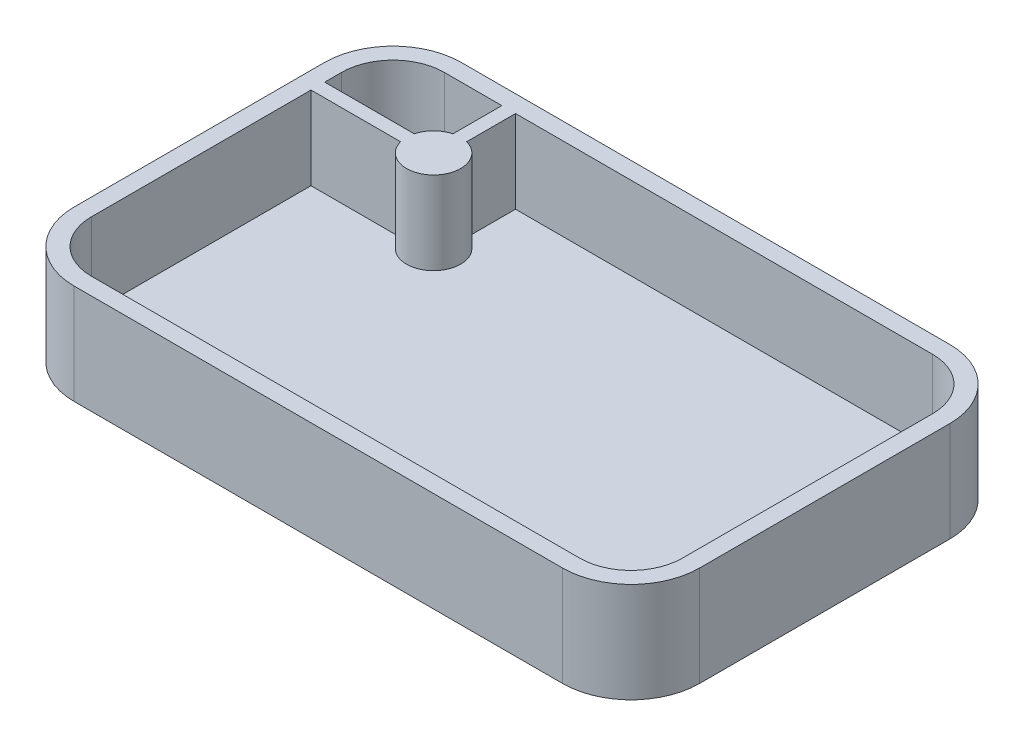
ISO-10303-21;
HEADER;
FILE_DESCRIPTION(('STEP AP214'),'2;1');
FILE_NAME('part.step','',(''),(''),'','','');
FILE_SCHEMA(('AUTOMOTIVE_DESIGN { 1 0 10303 214 1 1 1 1 }'));
ENDSEC;
DATA;
#1=APPLICATION_CONTEXT('core data for automotive mechanical design processes');
#2=APPLICATION_PROTOCOL_DEFINITION('international standard','automotive_design',2000,#1);
#3=PRODUCT_CONTEXT('',#1,'mechanical');
#4=PRODUCT('Part','Part','',(#3));
#5=PRODUCT_RELATED_PRODUCT_CATEGORY('part','',(#4));
#6=PRODUCT_DEFINITION_FORMATION('','',#4);
#7=PRODUCT_DEFINITION_CONTEXT('part definition',#1,'design');
#8=PRODUCT_DEFINITION('design','',#6,#7);
#9=PRODUCT_DEFINITION_SHAPE('','',#8);
#10=(LENGTH_UNIT() NAMED_UNIT(*) SI_UNIT(.MILLI.,.METRE.));
#11=(NAMED_UNIT(*) PLANE_ANGLE_UNIT() SI_UNIT($,.RADIAN.));
#12=(NAMED_UNIT(*) SI_UNIT($,.STERADIAN.) SOLID_ANGLE_UNIT());
#13=UNCERTAINTY_MEASURE_WITH_UNIT(LENGTH_MEASURE(1.E-05),#10,'distance_accuracy_value','');
#14=(GEOMETRIC_REPRESENTATION_CONTEXT(3) GLOBAL_UNCERTAINTY_ASSIGNED_CONTEXT((#13)) GLOBAL_UNIT_ASSIGNED_CONTEXT((#10,
#11,#12)) REPRESENTATION_CONTEXT('',''));
#15=CARTESIAN_POINT('',(0.,0.,0.));
#16=DIRECTION('',(0.,0.,1.));
#17=DIRECTION('',(1.,0.,0.));
#18=AXIS2_PLACEMENT_3D('',#15,#16,#17);
#19=CARTESIAN_POINT('',(12.7000000000001,-18.542,-68.6239533123605));
#20=DIRECTION('',(0.,0.,-1.));
#21=DIRECTION('',(-1.,0.,0.));
#22=AXIS2_PLACEMENT_3D('',#19,#20,#21);
#23=PLANE('',#22);
#24=DIRECTION('',(0.,1.,0.));
#25=VECTOR('',#24,1.);
#26=CARTESIAN_POINT('',(25.9077508486262,0.,-68.6239533123605));
#27=LINE('',#26,#25);
#28=CARTESIAN_POINT('',(25.9077508486262,0.,-68.6239533123605));
#29=VERTEX_POINT('',#28);
#30=CARTESIAN_POINT('',(25.9077508486262,-15.367,-68.6239533123605));
#31=VERTEX_POINT('',#30);
#32=EDGE_CURVE('E369',#29,#31,#27,.F.);
#33=ORIENTED_EDGE('',*,*,#32,.T.);
#34=DIRECTION('',(-1.,0.,0.));
#35=VECTOR('',#34,1.);
#36=CARTESIAN_POINT('',(103.254058746617,-15.367,-68.6239533123605));
#37=LINE('',#36,#35);
#38=CARTESIAN_POINT('',(103.254058746617,-15.367,-68.6239533123605));
#39=VERTEX_POINT('',#38);
#40=EDGE_CURVE('E250',#39,#31,#37,.T.);
#41=ORIENTED_EDGE('',*,*,#40,.F.);
#42=DIRECTION('',(0.,1.,0.));
#43=VECTOR('',#42,1.);
#44=CARTESIAN_POINT('',(103.254058746617,-18.542,-68.6239533123605));
#45=LINE('',#44,#43);
#46=CARTESIAN_POINT('',(103.254058746617,0.,-68.6239533123605));
#47=VERTEX_POINT('',#46);
#48=EDGE_CURVE('E246',#39,#47,#45,.T.);
#49=ORIENTED_EDGE('',*,*,#48,.T.);
#50=DIRECTION('',(-1.,0.,0.));
#51=VECTOR('',#50,1.);
#52=CARTESIAN_POINT('',(103.254058746617,0.,-68.6239533123605));
#53=LINE('',#52,#51);
#54=EDGE_CURVE('E58',#47,#29,#53,.T.);
#55=ORIENTED_EDGE('',*,*,#54,.T.);
#56=EDGE_LOOP('',(#33,#41,#49,#55));
#57=FACE_BOUND('',#56,.T.);
#58=ADVANCED_FACE('F33',(#57),#23,.F.);
#59=CARTESIAN_POINT('',(103.254058746617,-15.367,-12.7));
#60=DIRECTION('',(0.,1.,0.));
#61=DIRECTION('',(0.,0.,1.));
#62=AXIS2_PLACEMENT_3D('',#59,#60,#61);
#63=PLANE('',#62);
#64=CARTESIAN_POINT('',(24.6377508486262,-15.3670000000261,-54.7015297996723));
#65=DIRECTION('',(0.,1.,0.));
#66=DIRECTION('',(0.,0.,1.));
#67=AXIS2_PLACEMENT_3D('',#64,#65,#66);
#68=CIRCLE('',#67,5.0192867652901);
#69=CARTESIAN_POINT('',(23.3677508486262,-15.3670000000261,-59.5574889873319));
#70=VERTEX_POINT('',#69);
#71=CARTESIAN_POINT('',(19.7817916609665,-15.3670000000261,-55.9715297996723));
#72=VERTEX_POINT('',#71);
#73=EDGE_CURVE('E319',#70,#72,#68,.T.);
#74=ORIENTED_EDGE('',*,*,#73,.F.);
#75=DIRECTION('',(0.,0.,1.));
#76=VECTOR('',#75,1.);
#77=CARTESIAN_POINT('',(23.3677508486262,-15.367,-12.7));
#78=LINE('',#77,#76);
#79=CARTESIAN_POINT('',(23.3677508486262,-15.367,-68.6239533123605));
#80=VERTEX_POINT('',#79);
#81=EDGE_CURVE('E11',#80,#70,#78,.T.);
#82=ORIENTED_EDGE('',*,*,#81,.F.);
#83=CARTESIAN_POINT('',(12.7000000000001,-15.367,-68.6239533123605));
#84=VERTEX_POINT('',#83);
#85=EDGE_CURVE('E254',#80,#84,#37,.T.);
#86=ORIENTED_EDGE('',*,*,#85,.T.);
#87=CARTESIAN_POINT('',(12.7,-15.367,-59.0989533123605));
#88=DIRECTION('',(0.,1.,0.));
#89=DIRECTION('',(0.,0.,1.));
#90=AXIS2_PLACEMENT_3D('',#87,#88,#89);
#91=CIRCLE('',#90,9.525);
#92=CARTESIAN_POINT('',(3.175,-15.367,-59.0989533123604));
#93=VERTEX_POINT('',#92);
#94=EDGE_CURVE('E247',#84,#93,#91,.T.);
#95=ORIENTED_EDGE('',*,*,#94,.T.);
#96=DIRECTION('',(0.,0.,1.));
#97=VECTOR('',#96,1.);
#98=CARTESIAN_POINT('',(3.175,-15.367,-12.7));
#99=LINE('',#98,#97);
#100=CARTESIAN_POINT('',(3.175,-15.367,-55.9715297996723));
#101=VERTEX_POINT('',#100);
#102=EDGE_CURVE('E238',#93,#101,#99,.T.);
#103=ORIENTED_EDGE('',*,*,#102,.T.);
#104=DIRECTION('',(1.,0.,0.));
#105=VECTOR('',#104,1.);
#106=CARTESIAN_POINT('',(103.254058746617,-15.367,-55.9715297996723));
#107=LINE('',#106,#105);
#108=EDGE_CURVE('E342',#101,#72,#107,.T.);
#109=ORIENTED_EDGE('',*,*,#108,.T.);
#110=EDGE_LOOP('',(#74,#82,#86,#95,#103,#109));
#111=FACE_BOUND('',#110,.T.);
#112=ADVANCED_FACE('F401',(#111),#63,.T.);
#113=CARTESIAN_POINT('',(24.6377508486262,-500000.,-54.7015297996723));
#114=DIRECTION('',(0.,1.,0.));
#115=DIRECTION('',(0.,0.,1.));
#116=AXIS2_PLACEMENT_3D('',#113,#114,#115);
#117=CYLINDRICAL_SURFACE('',#116,5.0192867652901);
#118=CARTESIAN_POINT('',(24.6377508486262,0.,-54.7015297996723));
#119=DIRECTION('',(0.,1.,0.));
#120=DIRECTION('',(0.,0.,1.));
#121=AXIS2_PLACEMENT_3D('',#118,#119,#120);
#122=CIRCLE('',#121,5.0192867652901);
#123=CARTESIAN_POINT('',(23.3677508486262,0.,-59.5574889873319));
#124=VERTEX_POINT('',#123);
#125=CARTESIAN_POINT('',(19.7817916609665,0.,-55.9715297996723));
#126=VERTEX_POINT('',#125);
#127=EDGE_CURVE('E383',#124,#126,#122,.T.);
#128=ORIENTED_EDGE('',*,*,#127,.F.);
#129=DIRECTION('',(0.,1.,0.));
#130=VECTOR('',#129,1.);
#131=CARTESIAN_POINT('',(23.3677508486262,-500000.,-59.5574889873319));
#132=LINE('',#131,#130);
#133=EDGE_CURVE('E350',#124,#70,#132,.F.);
#134=ORIENTED_EDGE('',*,*,#133,.T.);
#135=ORIENTED_EDGE('',*,*,#73,.T.);
#136=DIRECTION('',(0.,1.,0.));
#137=VECTOR('',#136,1.);
#138=CARTESIAN_POINT('',(19.7817916609665,-500000.,-55.9715297996723));
#139=LINE('',#138,#137);
#140=EDGE_CURVE('E339',#126,#72,#139,.F.);
#141=ORIENTED_EDGE('',*,*,#140,.F.);
#142=EDGE_LOOP('',(#128,#134,#135,#141));
#143=FACE_BOUND('',#142,.T.);
#144=ADVANCED_FACE('F399',(#143),#117,.T.);
#145=CARTESIAN_POINT('',(3.175,-18.542,-12.7000000000001));
#146=DIRECTION('',(-1.,0.,0.));
#147=DIRECTION('',(0.,0.,1.));
#148=AXIS2_PLACEMENT_3D('',#145,#146,#147);
#149=PLANE('',#148);
#150=DIRECTION('',(0.,1.,0.));
#151=VECTOR('',#150,1.);
#152=CARTESIAN_POINT('',(3.175,0.,-55.9715297996723));
#153=LINE('',#152,#151);
#154=CARTESIAN_POINT('',(3.175,0.,-55.9715297996723));
#155=VERTEX_POINT('',#154);
#156=EDGE_CURVE('E384',#155,#101,#153,.F.);
#157=ORIENTED_EDGE('',*,*,#156,.T.);
#158=ORIENTED_EDGE('',*,*,#102,.F.);
#159=DIRECTION('',(0.,1.,0.));
#160=VECTOR('',#159,1.);
#161=CARTESIAN_POINT('',(3.175,-18.542,-59.0989533123604));
#162=LINE('',#161,#160);
#163=CARTESIAN_POINT('',(3.175,0.,-59.0989533123604));
#164=VERTEX_POINT('',#163);
#165=EDGE_CURVE('E236',#93,#164,#162,.T.);
#166=ORIENTED_EDGE('',*,*,#165,.T.);
#167=DIRECTION('',(0.,0.,1.));
#168=VECTOR('',#167,1.);
#169=CARTESIAN_POINT('',(3.175,0.,-12.7));
#170=LINE('',#169,#168);
#171=EDGE_CURVE('E273',#164,#155,#170,.T.);
#172=ORIENTED_EDGE('',*,*,#171,.T.);
#173=EDGE_LOOP('',(#157,#158,#166,#172));
#174=FACE_BOUND('',#173,.T.);
#175=ADVANCED_FACE('F405',(#174),#149,.F.);
#176=CARTESIAN_POINT('',(103.254058746617,-18.542,-12.7));
#177=DIRECTION('',(0.,1.,0.));
#178=DIRECTION('',(0.,0.,1.));
#179=AXIS2_PLACEMENT_3D('',#176,#177,#178);
#180=CYLINDRICAL_SURFACE('',#179,12.7);
#181=CARTESIAN_POINT('',(103.254058746617,0.,-12.7));
#182=DIRECTION('',(0.,1.,0.));
#183=DIRECTION('',(0.,0.,1.));
#184=AXIS2_PLACEMENT_3D('',#181,#182,#183);
#185=CIRCLE('',#184,12.7);
#186=CARTESIAN_POINT('',(103.254058746617,0.,0.));
#187=VERTEX_POINT('',#186);
#188=CARTESIAN_POINT('',(115.954058746617,0.,-12.7000000000001));
#189=VERTEX_POINT('',#188);
#190=EDGE_CURVE('E217',#187,#189,#185,.T.);
#191=ORIENTED_EDGE('',*,*,#190,.F.);
#192=DIRECTION('',(0.,1.,0.));
#193=VECTOR('',#192,1.);
#194=CARTESIAN_POINT('',(103.254058746617,-18.542,0.));
#195=LINE('',#194,#193);
#196=CARTESIAN_POINT('',(103.254058746617,-18.542,0.));
#197=VERTEX_POINT('',#196);
#198=EDGE_CURVE('E316',#197,#187,#195,.T.);
#199=ORIENTED_EDGE('',*,*,#198,.F.);
#200=CARTESIAN_POINT('',(103.254058746617,-18.542,-12.7));
#201=DIRECTION('',(0.,1.,0.));
#202=DIRECTION('',(0.,0.,1.));
#203=AXIS2_PLACEMENT_3D('',#200,#201,#202);
#204=CIRCLE('',#203,12.7);
#205=CARTESIAN_POINT('',(115.954058746617,-18.542,-12.7000000000001));
#206=VERTEX_POINT('',#205);
#207=EDGE_CURVE('E276',#197,#206,#204,.T.);
#208=ORIENTED_EDGE('',*,*,#207,.T.);
#209=DIRECTION('',(0.,1.,0.));
#210=VECTOR('',#209,1.);
#211=CARTESIAN_POINT('',(115.954058746617,-18.542,-12.7000000000001));
#212=LINE('',#211,#210);
#213=EDGE_CURVE('E297',#206,#189,#212,.T.);
#214=ORIENTED_EDGE('',*,*,#213,.T.);
#215=EDGE_LOOP('',(#191,#199,#208,#214));
#216=FACE_BOUND('',#215,.T.);
#217=ADVANCED_FACE('F35',(#216),#180,.T.);
#218=CARTESIAN_POINT('',(12.7000000000001,-18.542,0.));
#219=DIRECTION('',(0.,0.,1.));
#220=DIRECTION('',(1.,0.,0.));
#221=AXIS2_PLACEMENT_3D('',#218,#219,#220);
#222=PLANE('',#221);
#223=ORIENTED_EDGE('',*,*,#198,.T.);
#224=DIRECTION('',(1.,0.,0.));
#225=VECTOR('',#224,1.);
#226=CARTESIAN_POINT('',(12.7000000000001,0.,0.));
#227=LINE('',#226,#225);
#228=CARTESIAN_POINT('',(12.7000000000001,0.,0.));
#229=VERTEX_POINT('',#228);
#230=EDGE_CURVE('E280',#229,#187,#227,.T.);
#231=ORIENTED_EDGE('',*,*,#230,.F.);
#232=DIRECTION('',(0.,1.,0.));
#233=VECTOR('',#232,1.);
#234=CARTESIAN_POINT('',(12.7000000000001,-18.542,0.));
#235=LINE('',#234,#233);
#236=CARTESIAN_POINT('',(12.7000000000001,-18.542,0.));
#237=VERTEX_POINT('',#236);
#238=EDGE_CURVE('E320',#237,#229,#235,.T.);
#239=ORIENTED_EDGE('',*,*,#238,.F.);
#240=DIRECTION('',(1.,0.,0.));
#241=VECTOR('',#240,1.);
#242=CARTESIAN_POINT('',(12.7000000000001,-18.542,0.));
#243=LINE('',#242,#241);
#244=EDGE_CURVE('E295',#237,#197,#243,.T.);
#245=ORIENTED_EDGE('',*,*,#244,.T.);
#246=EDGE_LOOP('',(#223,#231,#239,#245));
#247=FACE_BOUND('',#246,.T.);
#248=ADVANCED_FACE('F481',(#247),#222,.T.);
#249=CARTESIAN_POINT('',(12.7,-18.542,-12.7));
#250=DIRECTION('',(0.,1.,0.));
#251=DIRECTION('',(0.,0.,1.));
#252=AXIS2_PLACEMENT_3D('',#249,#250,#251);
#253=CYLINDRICAL_SURFACE('',#252,12.7);
#254=CARTESIAN_POINT('',(12.7,0.,-12.7));
#255=DIRECTION('',(0.,1.,0.));
#256=DIRECTION('',(0.,0.,-1.));
#257=AXIS2_PLACEMENT_3D('',#254,#255,#256);
#258=CIRCLE('',#257,12.7);
#259=CARTESIAN_POINT('',(0.,0.,-12.7000000000001));
#260=VERTEX_POINT('',#259);
#261=EDGE_CURVE('E312',#260,#229,#258,.T.);
#262=ORIENTED_EDGE('',*,*,#261,.F.);
#263=DIRECTION('',(0.,1.,0.));
#264=VECTOR('',#263,1.);
#265=CARTESIAN_POINT('',(0.,-18.542,-12.7000000000001));
#266=LINE('',#265,#264);
#267=CARTESIAN_POINT('',(0.,-18.542,-12.7000000000001));
#268=VERTEX_POINT('',#267);
#269=EDGE_CURVE('E322',#268,#260,#266,.T.);
#270=ORIENTED_EDGE('',*,*,#269,.F.);
#271=CARTESIAN_POINT('',(12.7,-18.542,-12.7));
#272=DIRECTION('',(0.,1.,0.));
#273=DIRECTION('',(0.,0.,-1.));
#274=AXIS2_PLACEMENT_3D('',#271,#272,#273);
#275=CIRCLE('',#274,12.7);
#276=EDGE_CURVE('E292',#268,#237,#275,.T.);
#277=ORIENTED_EDGE('',*,*,#276,.T.);
#278=ORIENTED_EDGE('',*,*,#238,.T.);
#279=EDGE_LOOP('',(#262,#270,#277,#278));
#280=FACE_BOUND('',#279,.T.);
#281=ADVANCED_FACE('F484',(#280),#253,.T.);
#282=CARTESIAN_POINT('',(0.,-18.542,-12.7000000000001));
#283=DIRECTION('',(-1.,0.,0.));
#284=DIRECTION('',(0.,0.,1.));
#285=AXIS2_PLACEMENT_3D('',#282,#283,#284);
#286=PLANE('',#285);
#287=ORIENTED_EDGE('',*,*,#269,.T.);
#288=DIRECTION('',(0.,0.,1.));
#289=VECTOR('',#288,1.);
#290=CARTESIAN_POINT('',(0.,0.,-12.7000000000001));
#291=LINE('',#290,#289);
#292=CARTESIAN_POINT('',(0.,0.,-59.0989533123604));
#293=VERTEX_POINT('',#292);
#294=EDGE_CURVE('E310',#293,#260,#291,.T.);
#295=ORIENTED_EDGE('',*,*,#294,.F.);
#296=DIRECTION('',(0.,1.,0.));
#297=VECTOR('',#296,1.);
#298=CARTESIAN_POINT('',(0.,-18.542,-59.0989533123604));
#299=LINE('',#298,#297);
#300=CARTESIAN_POINT('',(0.,-18.542,-59.0989533123604));
#301=VERTEX_POINT('',#300);
#302=EDGE_CURVE('E325',#301,#293,#299,.T.);
#303=ORIENTED_EDGE('',*,*,#302,.F.);
#304=DIRECTION('',(0.,0.,1.));
#305=VECTOR('',#304,1.);
#306=CARTESIAN_POINT('',(0.,-18.542,-12.7000000000001));
#307=LINE('',#306,#305);
#308=EDGE_CURVE('E290',#301,#268,#307,.T.);
#309=ORIENTED_EDGE('',*,*,#308,.T.);
#310=EDGE_LOOP('',(#287,#295,#303,#309));
#311=FACE_BOUND('',#310,.T.);
#312=ADVANCED_FACE('F488',(#311),#286,.T.);
#313=CARTESIAN_POINT('',(12.7,-18.542,-59.0989533123605));
#314=DIRECTION('',(0.,1.,0.));
#315=DIRECTION('',(0.,0.,1.));
#316=AXIS2_PLACEMENT_3D('',#313,#314,#315);
#317=CYLINDRICAL_SURFACE('',#316,12.7);
#318=CARTESIAN_POINT('',(12.7,0.,-59.0989533123605));
#319=DIRECTION('',(0.,1.,0.));
#320=DIRECTION('',(0.,0.,-1.));
#321=AXIS2_PLACEMENT_3D('',#318,#319,#320);
#322=CIRCLE('',#321,12.7);
#323=CARTESIAN_POINT('',(12.7000000000001,0.,-71.7989533123605));
#324=VERTEX_POINT('',#323);
#325=EDGE_CURVE('E307',#324,#293,#322,.T.);
#326=ORIENTED_EDGE('',*,*,#325,.F.);
#327=DIRECTION('',(0.,1.,0.));
#328=VECTOR('',#327,1.);
#329=CARTESIAN_POINT('',(12.7000000000001,-18.542,-71.7989533123605));
#330=LINE('',#329,#328);
#331=CARTESIAN_POINT('',(12.7000000000001,-18.542,-71.7989533123605));
#332=VERTEX_POINT('',#331);
#333=EDGE_CURVE('E327',#332,#324,#330,.T.);
#334=ORIENTED_EDGE('',*,*,#333,.F.);
#335=CARTESIAN_POINT('',(12.7,-18.542,-59.0989533123605));
#336=DIRECTION('',(0.,1.,0.));
#337=DIRECTION('',(0.,0.,-1.));
#338=AXIS2_PLACEMENT_3D('',#335,#336,#337);
#339=CIRCLE('',#338,12.7);
#340=EDGE_CURVE('E287',#332,#301,#339,.T.);
#341=ORIENTED_EDGE('',*,*,#340,.T.);
#342=ORIENTED_EDGE('',*,*,#302,.T.);
#343=EDGE_LOOP('',(#326,#334,#341,#342));
#344=FACE_BOUND('',#343,.T.);
#345=ADVANCED_FACE('F492',(#344),#317,.T.);
#346=CARTESIAN_POINT('',(12.7000000000001,-18.542,-71.7989533123605));
#347=DIRECTION('',(0.,0.,-1.));
#348=DIRECTION('',(-1.,0.,0.));
#349=AXIS2_PLACEMENT_3D('',#346,#347,#348);
#350=PLANE('',#349);
#351=ORIENTED_EDGE('',*,*,#333,.T.);
#352=DIRECTION('',(-1.,0.,0.));
#353=VECTOR('',#352,1.);
#354=CARTESIAN_POINT('',(12.7000000000001,0.,-71.7989533123605));
#355=LINE('',#354,#353);
#356=CARTESIAN_POINT('',(103.254058746617,0.,-71.7989533123605));
#357=VERTEX_POINT('',#356);
#358=EDGE_CURVE('E305',#357,#324,#355,.T.);
#359=ORIENTED_EDGE('',*,*,#358,.F.);
#360=DIRECTION('',(0.,1.,0.));
#361=VECTOR('',#360,1.);
#362=CARTESIAN_POINT('',(103.254058746617,-18.542,-71.7989533123605));
#363=LINE('',#362,#361);
#364=CARTESIAN_POINT('',(103.254058746617,-18.542,-71.7989533123605));
#365=VERTEX_POINT('',#364);
#366=EDGE_CURVE('E330',#365,#357,#363,.T.);
#367=ORIENTED_EDGE('',*,*,#366,.F.);
#368=DIRECTION('',(-1.,0.,0.));
#369=VECTOR('',#368,1.);
#370=CARTESIAN_POINT('',(12.7000000000001,-18.542,-71.7989533123605));
#371=LINE('',#370,#369);
#372=EDGE_CURVE('E285',#365,#332,#371,.T.);
#373=ORIENTED_EDGE('',*,*,#372,.T.);
#374=EDGE_LOOP('',(#351,#359,#367,#373));
#375=FACE_BOUND('',#374,.T.);
#376=ADVANCED_FACE('F496',(#375),#350,.T.);
#377=CARTESIAN_POINT('',(103.254058746617,-18.542,-59.0989533123605));
#378=DIRECTION('',(0.,1.,0.));
#379=DIRECTION('',(0.,0.,1.));
#380=AXIS2_PLACEMENT_3D('',#377,#378,#379);
#381=CYLINDRICAL_SURFACE('',#380,12.7);
#382=CARTESIAN_POINT('',(103.254058746617,0.,-59.0989533123605));
#383=DIRECTION('',(0.,1.,0.));
#384=DIRECTION('',(0.,0.,-1.));
#385=AXIS2_PLACEMENT_3D('',#382,#383,#384);
#386=CIRCLE('',#385,12.7);
#387=CARTESIAN_POINT('',(115.954058746617,0.,-59.0989533123604));
#388=VERTEX_POINT('',#387);
#389=EDGE_CURVE('E302',#388,#357,#386,.T.);
#390=ORIENTED_EDGE('',*,*,#389,.F.);
#391=DIRECTION('',(0.,1.,0.));
#392=VECTOR('',#391,1.);
#393=CARTESIAN_POINT('',(115.954058746617,-18.542,-59.0989533123604));
#394=LINE('',#393,#392);
#395=CARTESIAN_POINT('',(115.954058746617,-18.542,-59.0989533123604));
#396=VERTEX_POINT('',#395);
#397=EDGE_CURVE('E332',#396,#388,#394,.T.);
#398=ORIENTED_EDGE('',*,*,#397,.F.);
#399=CARTESIAN_POINT('',(103.254058746617,-18.542,-59.0989533123605));
#400=DIRECTION('',(0.,1.,0.));
#401=DIRECTION('',(0.,0.,-1.));
#402=AXIS2_PLACEMENT_3D('',#399,#400,#401);
#403=CIRCLE('',#402,12.7);
#404=EDGE_CURVE('E282',#396,#365,#403,.T.);
#405=ORIENTED_EDGE('',*,*,#404,.T.);
#406=ORIENTED_EDGE('',*,*,#366,.T.);
#407=EDGE_LOOP('',(#390,#398,#405,#406));
#408=FACE_BOUND('',#407,.T.);
#409=ADVANCED_FACE('F500',(#408),#381,.T.);
#410=CARTESIAN_POINT('',(115.954058746617,-18.542,-12.7000000000001));
#411=DIRECTION('',(1.,0.,0.));
#412=DIRECTION('',(0.,0.,-1.));
#413=AXIS2_PLACEMENT_3D('',#410,#411,#412);
#414=PLANE('',#413);
#415=ORIENTED_EDGE('',*,*,#397,.T.);
#416=DIRECTION('',(0.,0.,-1.));
#417=VECTOR('',#416,1.);
#418=CARTESIAN_POINT('',(115.954058746617,0.,-12.7000000000001));
#419=LINE('',#418,#417);
#420=EDGE_CURVE('E300',#189,#388,#419,.T.);
#421=ORIENTED_EDGE('',*,*,#420,.F.);
#422=ORIENTED_EDGE('',*,*,#213,.F.);
#423=DIRECTION('',(0.,0.,-1.));
#424=VECTOR('',#423,1.);
#425=CARTESIAN_POINT('',(115.954058746617,-18.542,-12.7000000000001));
#426=LINE('',#425,#424);
#427=EDGE_CURVE('E279',#206,#396,#426,.T.);
#428=ORIENTED_EDGE('',*,*,#427,.T.);
#429=EDGE_LOOP('',(#415,#421,#422,#428));
#430=FACE_BOUND('',#429,.T.);
#431=ADVANCED_FACE('F477',(#430),#414,.T.);
#432=CARTESIAN_POINT('',(103.254058746617,-18.542,-12.7));
#433=DIRECTION('',(0.,1.,0.));
#434=DIRECTION('',(0.,0.,1.));
#435=AXIS2_PLACEMENT_3D('',#432,#433,#434);
#436=PLANE('',#435);
#437=ORIENTED_EDGE('',*,*,#207,.F.);
#438=ORIENTED_EDGE('',*,*,#244,.F.);
#439=ORIENTED_EDGE('',*,*,#276,.F.);
#440=ORIENTED_EDGE('',*,*,#308,.F.);
#441=ORIENTED_EDGE('',*,*,#340,.F.);
#442=ORIENTED_EDGE('',*,*,#372,.F.);
#443=ORIENTED_EDGE('',*,*,#404,.F.);
#444=ORIENTED_EDGE('',*,*,#427,.F.);
#445=EDGE_LOOP('',(#437,#438,#439,#440,#441,#442,#443,#444));
#446=FACE_BOUND('',#445,.T.);
#447=ADVANCED_FACE('F474',(#446),#436,.F.);
#448=CARTESIAN_POINT('',(103.254058746617,0.,-12.7));
#449=DIRECTION('',(0.,1.,0.));
#450=DIRECTION('',(0.,0.,1.));
#451=AXIS2_PLACEMENT_3D('',#448,#449,#450);
#452=PLANE('',#451);
#453=DIRECTION('',(0.,0.,1.));
#454=VECTOR('',#453,1.);
#455=CARTESIAN_POINT('',(25.9077508486262,0.,-59.7208165649623));
#456=LINE('',#455,#454);
#457=CARTESIAN_POINT('',(25.9077508486262,0.,-59.5574889873319));
#458=VERTEX_POINT('',#457);
#459=EDGE_CURVE('E360',#458,#29,#456,.F.);
#460=ORIENTED_EDGE('',*,*,#459,.T.);
#461=ORIENTED_EDGE('',*,*,#54,.F.);
#462=CARTESIAN_POINT('',(103.254058746617,0.,-59.0989533123605));
#463=DIRECTION('',(0.,1.,0.));
#464=DIRECTION('',(0.,0.,1.));
#465=AXIS2_PLACEMENT_3D('',#462,#463,#464);
#466=CIRCLE('',#465,9.525);
#467=CARTESIAN_POINT('',(112.779058746617,0.,-59.0989533123604));
#468=VERTEX_POINT('',#467);
#469=EDGE_CURVE('E264',#468,#47,#466,.T.);
#470=ORIENTED_EDGE('',*,*,#469,.F.);
#471=DIRECTION('',(0.,0.,-1.));
#472=VECTOR('',#471,1.);
#473=CARTESIAN_POINT('',(112.779058746617,0.,-12.7));
#474=LINE('',#473,#472);
#475=CARTESIAN_POINT('',(112.779058746617,0.,-12.7000000000001));
#476=VERTEX_POINT('',#475);
#477=EDGE_CURVE('E261',#476,#468,#474,.T.);
#478=ORIENTED_EDGE('',*,*,#477,.F.);
#479=CARTESIAN_POINT('',(103.254058746617,0.,-12.7));
#480=DIRECTION('',(0.,1.,0.));
#481=DIRECTION('',(0.,0.,1.));
#482=AXIS2_PLACEMENT_3D('',#479,#480,#481);
#483=CIRCLE('',#482,9.525);
#484=CARTESIAN_POINT('',(103.254058746617,0.,-3.175));
#485=VERTEX_POINT('',#484);
#486=EDGE_CURVE('E259',#485,#476,#483,.T.);
#487=ORIENTED_EDGE('',*,*,#486,.F.);
#488=DIRECTION('',(1.,0.,0.));
#489=VECTOR('',#488,1.);
#490=CARTESIAN_POINT('',(103.254058746617,0.,-3.175));
#491=LINE('',#490,#489);
#492=CARTESIAN_POINT('',(12.7000000000001,0.,-3.175));
#493=VERTEX_POINT('',#492);
#494=EDGE_CURVE('E213',#493,#485,#491,.T.);
#495=ORIENTED_EDGE('',*,*,#494,.F.);
#496=CARTESIAN_POINT('',(12.7,0.,-12.7));
#497=DIRECTION('',(0.,1.,0.));
#498=DIRECTION('',(0.,0.,1.));
#499=AXIS2_PLACEMENT_3D('',#496,#497,#498);
#500=CIRCLE('',#499,9.525);
#501=CARTESIAN_POINT('',(3.175,0.,-12.7000000000001));
#502=VERTEX_POINT('',#501);
#503=EDGE_CURVE('E226',#502,#493,#500,.T.);
#504=ORIENTED_EDGE('',*,*,#503,.F.);
#505=CARTESIAN_POINT('',(3.175,0.,-53.4315297996722));
#506=VERTEX_POINT('',#505);
#507=EDGE_CURVE('E272',#506,#502,#170,.T.);
#508=ORIENTED_EDGE('',*,*,#507,.F.);
#509=DIRECTION('',(-1.,0.,0.));
#510=VECTOR('',#509,1.);
#511=CARTESIAN_POINT('',(19.6184640833361,0.,-53.4315297996722));
#512=LINE('',#511,#510);
#513=CARTESIAN_POINT('',(19.7817916609665,0.,-53.4315297996722));
#514=VERTEX_POINT('',#513);
#515=EDGE_CURVE('E379',#506,#514,#512,.F.);
#516=ORIENTED_EDGE('',*,*,#515,.T.);
#517=EDGE_CURVE('E262',#514,#458,#122,.T.);
#518=ORIENTED_EDGE('',*,*,#517,.T.);
#519=EDGE_LOOP('',(#460,#461,#470,#478,#487,#495,#504,#508,#516,#518));
#520=FACE_BOUND('',#519,.T.);
#521=CARTESIAN_POINT('',(23.3677508486262,0.,-68.6239533123605));
#522=VERTEX_POINT('',#521);
#523=CARTESIAN_POINT('',(12.7000000000001,0.,-68.6239533123605));
#524=VERTEX_POINT('',#523);
#525=EDGE_CURVE('E267',#522,#524,#53,.T.);
#526=ORIENTED_EDGE('',*,*,#525,.F.);
#527=DIRECTION('',(0.,0.,-1.));
#528=VECTOR('',#527,1.);
#529=CARTESIAN_POINT('',(23.3677508486262,0.,-59.7208165649623));
#530=LINE('',#529,#528);
#531=EDGE_CURVE('E50',#522,#124,#530,.F.);
#532=ORIENTED_EDGE('',*,*,#531,.T.);
#533=ORIENTED_EDGE('',*,*,#127,.T.);
#534=DIRECTION('',(1.,0.,0.));
#535=VECTOR('',#534,1.);
#536=CARTESIAN_POINT('',(19.6184640833361,0.,-55.9715297996723));
#537=LINE('',#536,#535);
#538=EDGE_CURVE('E380',#126,#155,#537,.F.);
#539=ORIENTED_EDGE('',*,*,#538,.T.);
#540=ORIENTED_EDGE('',*,*,#171,.F.);
#541=CARTESIAN_POINT('',(12.7,0.,-59.0989533123605));
#542=DIRECTION('',(0.,1.,0.));
#543=DIRECTION('',(0.,0.,1.));
#544=AXIS2_PLACEMENT_3D('',#541,#542,#543);
#545=CIRCLE('',#544,9.525);
#546=EDGE_CURVE('E269',#524,#164,#545,.T.);
#547=ORIENTED_EDGE('',*,*,#546,.F.);
#548=EDGE_LOOP('',(#526,#532,#533,#539,#540,#547));
#549=FACE_BOUND('',#548,.T.);
#550=ORIENTED_EDGE('',*,*,#230,.T.);
#551=ORIENTED_EDGE('',*,*,#190,.T.);
#552=ORIENTED_EDGE('',*,*,#420,.T.);
#553=ORIENTED_EDGE('',*,*,#389,.T.);
#554=ORIENTED_EDGE('',*,*,#358,.T.);
#555=ORIENTED_EDGE('',*,*,#325,.T.);
#556=ORIENTED_EDGE('',*,*,#294,.T.);
#557=ORIENTED_EDGE('',*,*,#261,.T.);
#558=EDGE_LOOP('',(#550,#551,#552,#553,#554,#555,#556,#557));
#559=FACE_BOUND('',#558,.T.);
#560=ADVANCED_FACE('F391',(#520,#549,#559),#452,.T.);
#561=CARTESIAN_POINT('',(103.254058746617,-18.542,-12.7));
#562=DIRECTION('',(0.,1.,0.));
#563=DIRECTION('',(0.,0.,1.));
#564=AXIS2_PLACEMENT_3D('',#561,#562,#563);
#565=CYLINDRICAL_SURFACE('',#564,9.525);
#566=ORIENTED_EDGE('',*,*,#486,.T.);
#567=DIRECTION('',(0.,1.,0.));
#568=VECTOR('',#567,1.);
#569=CARTESIAN_POINT('',(112.779058746617,-18.542,-12.7000000000001));
#570=LINE('',#569,#568);
#571=CARTESIAN_POINT('',(112.779058746617,-15.367,-12.7000000000001));
#572=VERTEX_POINT('',#571);
#573=EDGE_CURVE('E207',#572,#476,#570,.T.);
#574=ORIENTED_EDGE('',*,*,#573,.F.);
#575=CARTESIAN_POINT('',(103.254058746617,-15.367,-12.7));
#576=DIRECTION('',(0.,1.,0.));
#577=DIRECTION('',(0.,0.,1.));
#578=AXIS2_PLACEMENT_3D('',#575,#576,#577);
#579=CIRCLE('',#578,9.525);
#580=CARTESIAN_POINT('',(103.254058746617,-15.367,-3.175));
#581=VERTEX_POINT('',#580);
#582=EDGE_CURVE('E202',#581,#572,#579,.T.);
#583=ORIENTED_EDGE('',*,*,#582,.F.);
#584=DIRECTION('',(0.,1.,0.));
#585=VECTOR('',#584,1.);
#586=CARTESIAN_POINT('',(103.254058746617,-18.542,-3.175));
#587=LINE('',#586,#585);
#588=EDGE_CURVE('E210',#581,#485,#587,.T.);
#589=ORIENTED_EDGE('',*,*,#588,.T.);
#590=EDGE_LOOP('',(#566,#574,#583,#589));
#591=FACE_BOUND('',#590,.T.);
#592=ADVANCED_FACE('F220',(#591),#565,.F.);
#593=CARTESIAN_POINT('',(12.7000000000001,-18.542,-3.175));
#594=DIRECTION('',(0.,0.,1.));
#595=DIRECTION('',(1.,0.,0.));
#596=AXIS2_PLACEMENT_3D('',#593,#594,#595);
#597=PLANE('',#596);
#598=ORIENTED_EDGE('',*,*,#588,.F.);
#599=DIRECTION('',(1.,0.,0.));
#600=VECTOR('',#599,1.);
#601=CARTESIAN_POINT('',(103.254058746617,-15.367,-3.175));
#602=LINE('',#601,#600);
#603=CARTESIAN_POINT('',(12.7000000000001,-15.367,-3.175));
#604=VERTEX_POINT('',#603);
#605=EDGE_CURVE('E198',#604,#581,#602,.T.);
#606=ORIENTED_EDGE('',*,*,#605,.F.);
#607=DIRECTION('',(0.,1.,0.));
#608=VECTOR('',#607,1.);
#609=CARTESIAN_POINT('',(12.7000000000001,-18.542,-3.175));
#610=LINE('',#609,#608);
#611=EDGE_CURVE('E218',#604,#493,#610,.T.);
#612=ORIENTED_EDGE('',*,*,#611,.T.);
#613=ORIENTED_EDGE('',*,*,#494,.T.);
#614=EDGE_LOOP('',(#598,#606,#612,#613));
#615=FACE_BOUND('',#614,.T.);
#616=ADVANCED_FACE('F211',(#615),#597,.F.);
#617=CARTESIAN_POINT('',(12.7,-18.542,-12.7));
#618=DIRECTION('',(0.,1.,0.));
#619=DIRECTION('',(0.,0.,1.));
#620=AXIS2_PLACEMENT_3D('',#617,#618,#619);
#621=CYLINDRICAL_SURFACE('',#620,9.525);
#622=ORIENTED_EDGE('',*,*,#503,.T.);
#623=ORIENTED_EDGE('',*,*,#611,.F.);
#624=CARTESIAN_POINT('',(12.7,-15.367,-12.7));
#625=DIRECTION('',(0.,1.,0.));
#626=DIRECTION('',(0.,0.,1.));
#627=AXIS2_PLACEMENT_3D('',#624,#625,#626);
#628=CIRCLE('',#627,9.525);
#629=CARTESIAN_POINT('',(3.175,-15.367,-12.7000000000001));
#630=VERTEX_POINT('',#629);
#631=EDGE_CURVE('E204',#630,#604,#628,.T.);
#632=ORIENTED_EDGE('',*,*,#631,.F.);
#633=DIRECTION('',(0.,1.,0.));
#634=VECTOR('',#633,1.);
#635=CARTESIAN_POINT('',(3.175,-18.542,-12.7000000000001));
#636=LINE('',#635,#634);
#637=EDGE_CURVE('E232',#630,#502,#636,.T.);
#638=ORIENTED_EDGE('',*,*,#637,.T.);
#639=EDGE_LOOP('',(#622,#623,#632,#638));
#640=FACE_BOUND('',#639,.T.);
#641=ADVANCED_FACE('F443',(#640),#621,.F.);
#642=CARTESIAN_POINT('',(3.175,-15.367,-53.4315297996722));
#643=VERTEX_POINT('',#642);
#644=EDGE_CURVE('E243',#643,#630,#99,.T.);
#645=ORIENTED_EDGE('',*,*,#644,.F.);
#646=DIRECTION('',(0.,1.,0.));
#647=VECTOR('',#646,1.);
#648=CARTESIAN_POINT('',(3.175,0.,-53.4315297996722));
#649=LINE('',#648,#647);
#650=EDGE_CURVE('E376',#506,#643,#649,.F.);
#651=ORIENTED_EDGE('',*,*,#650,.F.);
#652=ORIENTED_EDGE('',*,*,#507,.T.);
#653=ORIENTED_EDGE('',*,*,#637,.F.);
#654=EDGE_LOOP('',(#645,#651,#652,#653));
#655=FACE_BOUND('',#654,.T.);
#656=ADVANCED_FACE('F439',(#655),#149,.F.);
#657=CARTESIAN_POINT('',(12.7,-18.542,-59.0989533123605));
#658=DIRECTION('',(0.,1.,0.));
#659=DIRECTION('',(0.,0.,1.));
#660=AXIS2_PLACEMENT_3D('',#657,#658,#659);
#661=CYLINDRICAL_SURFACE('',#660,9.525);
#662=ORIENTED_EDGE('',*,*,#546,.T.);
#663=ORIENTED_EDGE('',*,*,#165,.F.);
#664=ORIENTED_EDGE('',*,*,#94,.F.);
#665=DIRECTION('',(0.,1.,0.));
#666=VECTOR('',#665,1.);
#667=CARTESIAN_POINT('',(12.7000000000001,-18.542,-68.6239533123605));
#668=LINE('',#667,#666);
#669=EDGE_CURVE('E240',#84,#524,#668,.T.);
#670=ORIENTED_EDGE('',*,*,#669,.T.);
#671=EDGE_LOOP('',(#662,#663,#664,#670));
#672=FACE_BOUND('',#671,.T.);
#673=ADVANCED_FACE('F408',(#672),#661,.F.);
#674=ORIENTED_EDGE('',*,*,#85,.F.);
#675=DIRECTION('',(0.,1.,0.));
#676=VECTOR('',#675,1.);
#677=CARTESIAN_POINT('',(23.3677508486262,0.,-68.6239533123605));
#678=LINE('',#677,#676);
#679=EDGE_CURVE('E371',#522,#80,#678,.F.);
#680=ORIENTED_EDGE('',*,*,#679,.F.);
#681=ORIENTED_EDGE('',*,*,#525,.T.);
#682=ORIENTED_EDGE('',*,*,#669,.F.);
#683=EDGE_LOOP('',(#674,#680,#681,#682));
#684=FACE_BOUND('',#683,.T.);
#685=ADVANCED_FACE('F412',(#684),#23,.F.);
#686=CARTESIAN_POINT('',(103.254058746617,-18.542,-59.0989533123605));
#687=DIRECTION('',(0.,1.,0.));
#688=DIRECTION('',(0.,0.,1.));
#689=AXIS2_PLACEMENT_3D('',#686,#687,#688);
#690=CYLINDRICAL_SURFACE('',#689,9.525);
#691=ORIENTED_EDGE('',*,*,#469,.T.);
#692=ORIENTED_EDGE('',*,*,#48,.F.);
#693=CARTESIAN_POINT('',(103.254058746617,-15.367,-59.0989533123605));
#694=DIRECTION('',(0.,1.,0.));
#695=DIRECTION('',(0.,0.,1.));
#696=AXIS2_PLACEMENT_3D('',#693,#694,#695);
#697=CIRCLE('',#696,9.525);
#698=CARTESIAN_POINT('',(112.779058746617,-15.367,-59.0989533123604));
#699=VERTEX_POINT('',#698);
#700=EDGE_CURVE('E224',#699,#39,#697,.T.);
#701=ORIENTED_EDGE('',*,*,#700,.F.);
#702=DIRECTION('',(0.,1.,0.));
#703=VECTOR('',#702,1.);
#704=CARTESIAN_POINT('',(112.779058746617,-18.542,-59.0989533123604));
#705=LINE('',#704,#703);
#706=EDGE_CURVE('E231',#699,#468,#705,.T.);
#707=ORIENTED_EDGE('',*,*,#706,.T.);
#708=EDGE_LOOP('',(#691,#692,#701,#707));
#709=FACE_BOUND('',#708,.T.);
#710=ADVANCED_FACE('F432',(#709),#690,.F.);
#711=CARTESIAN_POINT('',(112.779058746617,-18.542,-12.7000000000001));
#712=DIRECTION('',(1.,0.,0.));
#713=DIRECTION('',(0.,0.,-1.));
#714=AXIS2_PLACEMENT_3D('',#711,#712,#713);
#715=PLANE('',#714);
#716=ORIENTED_EDGE('',*,*,#706,.F.);
#717=DIRECTION('',(0.,0.,-1.));
#718=VECTOR('',#717,1.);
#719=CARTESIAN_POINT('',(112.779058746617,-15.367,-12.7));
#720=LINE('',#719,#718);
#721=EDGE_CURVE('E222',#572,#699,#720,.T.);
#722=ORIENTED_EDGE('',*,*,#721,.F.);
#723=ORIENTED_EDGE('',*,*,#573,.T.);
#724=ORIENTED_EDGE('',*,*,#477,.T.);
#725=EDGE_LOOP('',(#716,#722,#723,#724));
#726=FACE_BOUND('',#725,.T.);
#727=ADVANCED_FACE('F437',(#726),#715,.F.);
#728=DIRECTION('',(0.,0.,1.));
#729=VECTOR('',#728,1.);
#730=CARTESIAN_POINT('',(25.9077508486262,-15.367,-12.7));
#731=LINE('',#730,#729);
#732=CARTESIAN_POINT('',(25.9077508486262,-15.3670000000261,-59.5574889873319));
#733=VERTEX_POINT('',#732);
#734=EDGE_CURVE('E42',#31,#733,#731,.T.);
#735=ORIENTED_EDGE('',*,*,#734,.T.);
#736=CARTESIAN_POINT('',(19.7817916609665,-15.3670000000261,-53.4315297996722));
#737=VERTEX_POINT('',#736);
#738=EDGE_CURVE('E336',#737,#733,#68,.T.);
#739=ORIENTED_EDGE('',*,*,#738,.F.);
#740=DIRECTION('',(1.,0.,0.));
#741=VECTOR('',#740,1.);
#742=CARTESIAN_POINT('',(103.254058746617,-15.367,-53.4315297996722));
#743=LINE('',#742,#741);
#744=EDGE_CURVE('E340',#643,#737,#743,.T.);
#745=ORIENTED_EDGE('',*,*,#744,.F.);
#746=ORIENTED_EDGE('',*,*,#644,.T.);
#747=ORIENTED_EDGE('',*,*,#631,.T.);
#748=ORIENTED_EDGE('',*,*,#605,.T.);
#749=ORIENTED_EDGE('',*,*,#582,.T.);
#750=ORIENTED_EDGE('',*,*,#721,.T.);
#751=ORIENTED_EDGE('',*,*,#700,.T.);
#752=ORIENTED_EDGE('',*,*,#40,.T.);
#753=EDGE_LOOP('',(#735,#739,#745,#746,#747,#748,#749,#750,#751,#752));
#754=FACE_BOUND('',#753,.T.);
#755=ADVANCED_FACE('F200',(#754),#63,.T.);
#756=DIRECTION('',(0.,1.,0.));
#757=VECTOR('',#756,1.);
#758=CARTESIAN_POINT('',(25.9077508486262,-500000.,-59.5574889873319));
#759=LINE('',#758,#757);
#760=EDGE_CURVE('E37',#458,#733,#759,.F.);
#761=ORIENTED_EDGE('',*,*,#760,.F.);
#762=ORIENTED_EDGE('',*,*,#517,.F.);
#763=DIRECTION('',(0.,1.,0.));
#764=VECTOR('',#763,1.);
#765=CARTESIAN_POINT('',(19.7817916609665,-500000.,-53.4315297996722));
#766=LINE('',#765,#764);
#767=EDGE_CURVE('E345',#514,#737,#766,.F.);
#768=ORIENTED_EDGE('',*,*,#767,.T.);
#769=ORIENTED_EDGE('',*,*,#738,.T.);
#770=EDGE_LOOP('',(#761,#762,#768,#769));
#771=FACE_BOUND('',#770,.T.);
#772=ADVANCED_FACE('F363',(#771),#117,.T.);
#773=CARTESIAN_POINT('',(19.6184640833361,0.,-53.4315297996722));
#774=DIRECTION('',(0.,0.,-1.));
#775=DIRECTION('',(-1.,0.,0.));
#776=AXIS2_PLACEMENT_3D('',#773,#774,#775);
#777=PLANE('',#776);
#778=ORIENTED_EDGE('',*,*,#744,.T.);
#779=ORIENTED_EDGE('',*,*,#767,.F.);
#780=ORIENTED_EDGE('',*,*,#515,.F.);
#781=ORIENTED_EDGE('',*,*,#650,.T.);
#782=EDGE_LOOP('',(#778,#779,#780,#781));
#783=FACE_BOUND('',#782,.T.);
#784=ADVANCED_FACE('F421',(#783),#777,.F.);
#785=CARTESIAN_POINT('',(19.6184640833361,0.,-55.9715297996723));
#786=DIRECTION('',(0.,0.,-1.));
#787=DIRECTION('',(-1.,0.,0.));
#788=AXIS2_PLACEMENT_3D('',#785,#786,#787);
#789=PLANE('',#788);
#790=ORIENTED_EDGE('',*,*,#140,.T.);
#791=ORIENTED_EDGE('',*,*,#108,.F.);
#792=ORIENTED_EDGE('',*,*,#156,.F.);
#793=ORIENTED_EDGE('',*,*,#538,.F.);
#794=EDGE_LOOP('',(#790,#791,#792,#793));
#795=FACE_BOUND('',#794,.T.);
#796=ADVANCED_FACE('F397',(#795),#789,.T.);
#797=CARTESIAN_POINT('',(23.3677508486262,0.,-59.7208165649623));
#798=DIRECTION('',(1.,0.,0.));
#799=DIRECTION('',(0.,0.,-1.));
#800=AXIS2_PLACEMENT_3D('',#797,#798,#799);
#801=PLANE('',#800);
#802=ORIENTED_EDGE('',*,*,#81,.T.);
#803=ORIENTED_EDGE('',*,*,#133,.F.);
#804=ORIENTED_EDGE('',*,*,#531,.F.);
#805=ORIENTED_EDGE('',*,*,#679,.T.);
#806=EDGE_LOOP('',(#802,#803,#804,#805));
#807=FACE_BOUND('',#806,.T.);
#808=ADVANCED_FACE('F413',(#807),#801,.F.);
#809=CARTESIAN_POINT('',(25.9077508486262,0.,-59.7208165649623));
#810=DIRECTION('',(1.,0.,0.));
#811=DIRECTION('',(0.,0.,-1.));
#812=AXIS2_PLACEMENT_3D('',#809,#810,#811);
#813=PLANE('',#812);
#814=ORIENTED_EDGE('',*,*,#760,.T.);
#815=ORIENTED_EDGE('',*,*,#734,.F.);
#816=ORIENTED_EDGE('',*,*,#32,.F.);
#817=ORIENTED_EDGE('',*,*,#459,.F.);
#818=EDGE_LOOP('',(#814,#815,#816,#817));
#819=FACE_BOUND('',#818,.T.);
#820=ADVANCED_FACE('F358',(#819),#813,.T.);
#821=CLOSED_SHELL('',(#58,#112,#144,#175,#217,#248,#281,#312,#345,#376,#409,#431,#447,#560,#592,
#616,#641,#656,#673,#685,#710,#727,#755,#772,#784,#796,#808,#820));
#822=MANIFOLD_SOLID_BREP('B2',#821);
#823=ADVANCED_BREP_SHAPE_REPRESENTATION('',(#18,#822),#14);
#824=SHAPE_DEFINITION_REPRESENTATION(#9,#823);
ENDSEC;
END-ISO-10303-21;
